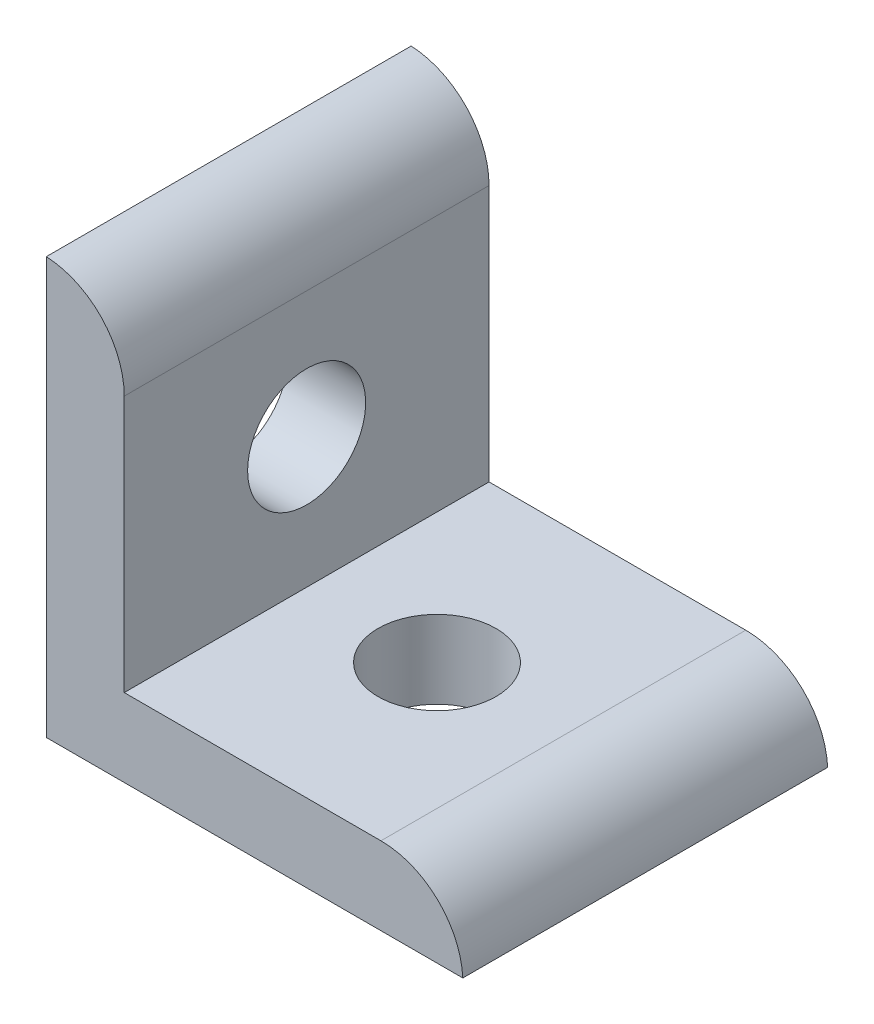
ISO-10303-21;
HEADER;
FILE_DESCRIPTION(('STEP AP214'),'2;1');
FILE_NAME('part.step','',(''),(''),'','','');
FILE_SCHEMA(('AUTOMOTIVE_DESIGN { 1 0 10303 214 1 1 1 1 }'));
ENDSEC;
DATA;
#1=APPLICATION_CONTEXT('core data for automotive mechanical design processes');
#2=APPLICATION_PROTOCOL_DEFINITION('international standard','automotive_design',2000,#1);
#3=PRODUCT_CONTEXT('',#1,'mechanical');
#4=PRODUCT('Part','Part','',(#3));
#5=PRODUCT_RELATED_PRODUCT_CATEGORY('part','',(#4));
#6=PRODUCT_DEFINITION_FORMATION('','',#4);
#7=PRODUCT_DEFINITION_CONTEXT('part definition',#1,'design');
#8=PRODUCT_DEFINITION('design','',#6,#7);
#9=PRODUCT_DEFINITION_SHAPE('','',#8);
#10=(LENGTH_UNIT() NAMED_UNIT(*) SI_UNIT(.MILLI.,.METRE.));
#11=(NAMED_UNIT(*) PLANE_ANGLE_UNIT() SI_UNIT($,.RADIAN.));
#12=(NAMED_UNIT(*) SI_UNIT($,.STERADIAN.) SOLID_ANGLE_UNIT());
#13=UNCERTAINTY_MEASURE_WITH_UNIT(LENGTH_MEASURE(1.E-05),#10,'distance_accuracy_value','');
#14=(GEOMETRIC_REPRESENTATION_CONTEXT(3) GLOBAL_UNCERTAINTY_ASSIGNED_CONTEXT((#13)) GLOBAL_UNIT_ASSIGNED_CONTEXT((#10,
#11,#12)) REPRESENTATION_CONTEXT('',''));
#15=CARTESIAN_POINT('',(0.,0.,0.));
#16=DIRECTION('',(0.,0.,1.));
#17=DIRECTION('',(1.,0.,0.));
#18=AXIS2_PLACEMENT_3D('',#15,#16,#17);
#19=CARTESIAN_POINT('',(0.,25.4,22.25));
#20=DIRECTION('',(1.,0.,0.));
#21=DIRECTION('',(0.,0.,-1.));
#22=AXIS2_PLACEMENT_3D('',#19,#20,#21);
#23=PLANE('',#22);
#24=CARTESIAN_POINT('',(0.,12.7,11.125));
#25=DIRECTION('',(-1.,0.,0.));
#26=DIRECTION('',(0.,0.,1.));
#27=AXIS2_PLACEMENT_3D('',#24,#25,#26);
#28=CIRCLE('',#27,3.6);
#29=CARTESIAN_POINT('',(0.,12.7,14.725));
#30=VERTEX_POINT('',#29);
#31=EDGE_CURVE('E164',#30,#30,#28,.T.);
#32=ORIENTED_EDGE('',*,*,#31,.F.);
#33=EDGE_LOOP('',(#32));
#34=FACE_BOUND('',#33,.T.);
#35=DIRECTION('',(0.,-1.,0.));
#36=VECTOR('',#35,1.);
#37=CARTESIAN_POINT('',(0.,25.4,0.));
#38=LINE('',#37,#36);
#39=CARTESIAN_POINT('',(0.,25.4,0.));
#40=VERTEX_POINT('',#39);
#41=CARTESIAN_POINT('',(0.,0.,0.));
#42=VERTEX_POINT('',#41);
#43=EDGE_CURVE('E131',#40,#42,#38,.T.);
#44=ORIENTED_EDGE('',*,*,#43,.T.);
#45=DIRECTION('',(0.,0.,-1.));
#46=VECTOR('',#45,1.);
#47=CARTESIAN_POINT('',(0.,0.,22.25));
#48=LINE('',#47,#46);
#49=CARTESIAN_POINT('',(0.,0.,22.25));
#50=VERTEX_POINT('',#49);
#51=EDGE_CURVE('E109',#50,#42,#48,.T.);
#52=ORIENTED_EDGE('',*,*,#51,.F.);
#53=DIRECTION('',(0.,-1.,0.));
#54=VECTOR('',#53,1.);
#55=CARTESIAN_POINT('',(0.,25.4,22.25));
#56=LINE('',#55,#54);
#57=CARTESIAN_POINT('',(0.,25.4,22.25));
#58=VERTEX_POINT('',#57);
#59=EDGE_CURVE('E100',#58,#50,#56,.T.);
#60=ORIENTED_EDGE('',*,*,#59,.F.);
#61=DIRECTION('',(0.,0.,-1.));
#62=VECTOR('',#61,1.);
#63=CARTESIAN_POINT('',(0.,25.4,22.25));
#64=LINE('',#63,#62);
#65=EDGE_CURVE('E107',#58,#40,#64,.T.);
#66=ORIENTED_EDGE('',*,*,#65,.T.);
#67=EDGE_LOOP('',(#44,#52,#60,#66));
#68=FACE_BOUND('',#67,.T.);
#69=ADVANCED_FACE('F45',(#34,#68),#23,.F.);
#70=CARTESIAN_POINT('',(0.,0.,22.25));
#71=DIRECTION('',(0.,1.,0.));
#72=DIRECTION('',(0.,0.,1.));
#73=AXIS2_PLACEMENT_3D('',#70,#71,#72);
#74=PLANE('',#73);
#75=CARTESIAN_POINT('',(12.7,0.,11.125));
#76=DIRECTION('',(0.,-1.,0.));
#77=DIRECTION('',(0.,0.,-1.));
#78=AXIS2_PLACEMENT_3D('',#75,#76,#77);
#79=CIRCLE('',#78,3.6);
#80=CARTESIAN_POINT('',(12.7,0.,7.525));
#81=VERTEX_POINT('',#80);
#82=EDGE_CURVE('E158',#81,#81,#79,.T.);
#83=ORIENTED_EDGE('',*,*,#82,.F.);
#84=EDGE_LOOP('',(#83));
#85=FACE_BOUND('',#84,.T.);
#86=DIRECTION('',(1.,0.,0.));
#87=VECTOR('',#86,1.);
#88=CARTESIAN_POINT('',(0.,0.,0.));
#89=LINE('',#88,#87);
#90=CARTESIAN_POINT('',(25.4,0.,0.));
#91=VERTEX_POINT('',#90);
#92=EDGE_CURVE('E138',#42,#91,#89,.T.);
#93=ORIENTED_EDGE('',*,*,#92,.T.);
#94=DIRECTION('',(0.,0.,-1.));
#95=VECTOR('',#94,1.);
#96=CARTESIAN_POINT('',(25.4,0.,22.25));
#97=LINE('',#96,#95);
#98=CARTESIAN_POINT('',(25.4,0.,22.25));
#99=VERTEX_POINT('',#98);
#100=EDGE_CURVE('E120',#99,#91,#97,.T.);
#101=ORIENTED_EDGE('',*,*,#100,.F.);
#102=DIRECTION('',(1.,0.,0.));
#103=VECTOR('',#102,1.);
#104=CARTESIAN_POINT('',(0.,0.,22.25));
#105=LINE('',#104,#103);
#106=EDGE_CURVE('E111',#50,#99,#105,.T.);
#107=ORIENTED_EDGE('',*,*,#106,.F.);
#108=ORIENTED_EDGE('',*,*,#51,.T.);
#109=EDGE_LOOP('',(#93,#101,#107,#108));
#110=FACE_BOUND('',#109,.T.);
#111=ADVANCED_FACE('F148',(#85,#110),#74,.F.);
#112=CARTESIAN_POINT('',(25.4,4.75,22.25));
#113=DIRECTION('',(0.,-1.,0.));
#114=DIRECTION('',(1.,0.,0.));
#115=AXIS2_PLACEMENT_3D('',#112,#113,#114);
#116=PLANE('',#115);
#117=CARTESIAN_POINT('',(12.7,4.75,11.125));
#118=DIRECTION('',(0.,-1.,0.));
#119=DIRECTION('',(1.,0.,0.));
#120=AXIS2_PLACEMENT_3D('',#117,#118,#119);
#121=CIRCLE('',#120,3.6);
#122=CARTESIAN_POINT('',(12.7,4.75,7.525));
#123=VERTEX_POINT('',#122);
#124=EDGE_CURVE('E149',#123,#123,#121,.F.);
#125=ORIENTED_EDGE('',*,*,#124,.F.);
#126=EDGE_LOOP('',(#125));
#127=FACE_BOUND('',#126,.T.);
#128=DIRECTION('',(-1.,0.,0.));
#129=VECTOR('',#128,1.);
#130=CARTESIAN_POINT('',(25.4,4.75,22.25));
#131=LINE('',#130,#129);
#132=CARTESIAN_POINT('',(20.4062539111405,4.75,22.25));
#133=VERTEX_POINT('',#132);
#134=CARTESIAN_POINT('',(4.75,4.75,22.25));
#135=VERTEX_POINT('',#134);
#136=EDGE_CURVE('E153',#133,#135,#131,.T.);
#137=ORIENTED_EDGE('',*,*,#136,.F.);
#138=DIRECTION('',(0.,0.,-1.));
#139=VECTOR('',#138,1.);
#140=CARTESIAN_POINT('',(20.4062539111405,4.75,22.25));
#141=LINE('',#140,#139);
#142=CARTESIAN_POINT('',(20.4062539111405,4.75,0.));
#143=VERTEX_POINT('',#142);
#144=EDGE_CURVE('E11',#133,#143,#141,.T.);
#145=ORIENTED_EDGE('',*,*,#144,.T.);
#146=DIRECTION('',(-1.,0.,0.));
#147=VECTOR('',#146,1.);
#148=CARTESIAN_POINT('',(25.4,4.75,0.));
#149=LINE('',#148,#147);
#150=CARTESIAN_POINT('',(4.75,4.75,0.));
#151=VERTEX_POINT('',#150);
#152=EDGE_CURVE('E136',#143,#151,#149,.T.);
#153=ORIENTED_EDGE('',*,*,#152,.T.);
#154=DIRECTION('',(0.,0.,-1.));
#155=VECTOR('',#154,1.);
#156=CARTESIAN_POINT('',(4.75,4.75,22.25));
#157=LINE('',#156,#155);
#158=EDGE_CURVE('E135',#135,#151,#157,.T.);
#159=ORIENTED_EDGE('',*,*,#158,.F.);
#160=EDGE_LOOP('',(#137,#145,#153,#159));
#161=FACE_BOUND('',#160,.T.);
#162=ADVANCED_FACE('F178',(#127,#161),#116,.F.);
#163=CARTESIAN_POINT('',(4.75,4.75,22.25));
#164=DIRECTION('',(-1.,0.,0.));
#165=DIRECTION('',(0.,-1.,0.));
#166=AXIS2_PLACEMENT_3D('',#163,#164,#165);
#167=PLANE('',#166);
#168=CARTESIAN_POINT('',(4.75,12.7,11.125));
#169=DIRECTION('',(-1.,0.,0.));
#170=DIRECTION('',(0.,-1.,0.));
#171=AXIS2_PLACEMENT_3D('',#168,#169,#170);
#172=CIRCLE('',#171,3.6);
#173=CARTESIAN_POINT('',(4.75,12.7,14.725));
#174=VERTEX_POINT('',#173);
#175=EDGE_CURVE('E161',#174,#174,#172,.F.);
#176=ORIENTED_EDGE('',*,*,#175,.F.);
#177=EDGE_LOOP('',(#176));
#178=FACE_BOUND('',#177,.T.);
#179=DIRECTION('',(0.,1.,0.));
#180=VECTOR('',#179,1.);
#181=CARTESIAN_POINT('',(4.75,4.75,0.));
#182=LINE('',#181,#180);
#183=CARTESIAN_POINT('',(4.75,20.4062539111405,0.));
#184=VERTEX_POINT('',#183);
#185=EDGE_CURVE('E112',#151,#184,#182,.T.);
#186=ORIENTED_EDGE('',*,*,#185,.T.);
#187=DIRECTION('',(0.,0.,1.));
#188=VECTOR('',#187,1.);
#189=CARTESIAN_POINT('',(4.75,20.4062539111405,22.25));
#190=LINE('',#189,#188);
#191=CARTESIAN_POINT('',(4.75,20.4062539111405,22.25));
#192=VERTEX_POINT('',#191);
#193=EDGE_CURVE('E68',#184,#192,#190,.T.);
#194=ORIENTED_EDGE('',*,*,#193,.T.);
#195=DIRECTION('',(0.,1.,0.));
#196=VECTOR('',#195,1.);
#197=CARTESIAN_POINT('',(4.75,4.75,22.25));
#198=LINE('',#197,#196);
#199=EDGE_CURVE('E102',#135,#192,#198,.T.);
#200=ORIENTED_EDGE('',*,*,#199,.F.);
#201=ORIENTED_EDGE('',*,*,#158,.T.);
#202=EDGE_LOOP('',(#186,#194,#200,#201));
#203=FACE_BOUND('',#202,.T.);
#204=ADVANCED_FACE('F133',(#178,#203),#167,.F.);
#205=CARTESIAN_POINT('',(0.,0.,22.25));
#206=DIRECTION('',(0.,0.,1.));
#207=DIRECTION('',(1.,0.,0.));
#208=AXIS2_PLACEMENT_3D('',#205,#206,#207);
#209=PLANE('',#208);
#210=ORIENTED_EDGE('',*,*,#199,.T.);
#211=CARTESIAN_POINT('',(-0.25,20.4062539111405,22.25));
#212=DIRECTION('',(0.,0.,1.));
#213=DIRECTION('',(1.,0.,0.));
#214=AXIS2_PLACEMENT_3D('',#211,#212,#213);
#215=CIRCLE('',#214,5.);
#216=EDGE_CURVE('E53',#192,#58,#215,.T.);
#217=ORIENTED_EDGE('',*,*,#216,.T.);
#218=ORIENTED_EDGE('',*,*,#59,.T.);
#219=ORIENTED_EDGE('',*,*,#106,.T.);
#220=CARTESIAN_POINT('',(20.4062539111405,-0.250000000000001,22.25));
#221=DIRECTION('',(0.,0.,1.));
#222=DIRECTION('',(1.,0.,0.));
#223=AXIS2_PLACEMENT_3D('',#220,#221,#222);
#224=CIRCLE('',#223,5.);
#225=EDGE_CURVE('E60',#99,#133,#224,.T.);
#226=ORIENTED_EDGE('',*,*,#225,.T.);
#227=ORIENTED_EDGE('',*,*,#136,.T.);
#228=EDGE_LOOP('',(#210,#217,#218,#219,#226,#227));
#229=FACE_BOUND('',#228,.T.);
#230=ADVANCED_FACE('F99',(#229),#209,.T.);
#231=CARTESIAN_POINT('',(0.,0.,0.));
#232=DIRECTION('',(0.,0.,1.));
#233=DIRECTION('',(1.,0.,0.));
#234=AXIS2_PLACEMENT_3D('',#231,#232,#233);
#235=PLANE('',#234);
#236=ORIENTED_EDGE('',*,*,#43,.F.);
#237=CARTESIAN_POINT('',(-0.25,20.4062539111405,0.));
#238=DIRECTION('',(0.,0.,1.));
#239=DIRECTION('',(1.,0.,0.));
#240=AXIS2_PLACEMENT_3D('',#237,#238,#239);
#241=CIRCLE('',#240,5.);
#242=EDGE_CURVE('E115',#40,#184,#241,.F.);
#243=ORIENTED_EDGE('',*,*,#242,.T.);
#244=ORIENTED_EDGE('',*,*,#185,.F.);
#245=ORIENTED_EDGE('',*,*,#152,.F.);
#246=CARTESIAN_POINT('',(20.4062539111405,-0.250000000000001,0.));
#247=DIRECTION('',(0.,0.,1.));
#248=DIRECTION('',(1.,0.,0.));
#249=AXIS2_PLACEMENT_3D('',#246,#247,#248);
#250=CIRCLE('',#249,5.);
#251=EDGE_CURVE('E117',#143,#91,#250,.F.);
#252=ORIENTED_EDGE('',*,*,#251,.T.);
#253=ORIENTED_EDGE('',*,*,#92,.F.);
#254=EDGE_LOOP('',(#236,#243,#244,#245,#252,#253));
#255=FACE_BOUND('',#254,.T.);
#256=ADVANCED_FACE('F128',(#255),#235,.F.);
#257=CARTESIAN_POINT('',(-0.25,20.4062539111405,22.25));
#258=DIRECTION('',(0.,0.,1.));
#259=DIRECTION('',(1.,0.,0.));
#260=AXIS2_PLACEMENT_3D('',#257,#258,#259);
#261=CYLINDRICAL_SURFACE('',#260,5.);
#262=ORIENTED_EDGE('',*,*,#216,.F.);
#263=ORIENTED_EDGE('',*,*,#193,.F.);
#264=ORIENTED_EDGE('',*,*,#242,.F.);
#265=ORIENTED_EDGE('',*,*,#65,.F.);
#266=EDGE_LOOP('',(#262,#263,#264,#265));
#267=FACE_BOUND('',#266,.T.);
#268=ADVANCED_FACE('F114',(#267),#261,.T.);
#269=CARTESIAN_POINT('',(20.4062539111405,-0.250000000000001,22.25));
#270=DIRECTION('',(0.,0.,-1.));
#271=DIRECTION('',(-1.,0.,0.));
#272=AXIS2_PLACEMENT_3D('',#269,#270,#271);
#273=CYLINDRICAL_SURFACE('',#272,5.);
#274=ORIENTED_EDGE('',*,*,#225,.F.);
#275=ORIENTED_EDGE('',*,*,#100,.T.);
#276=ORIENTED_EDGE('',*,*,#251,.F.);
#277=ORIENTED_EDGE('',*,*,#144,.F.);
#278=EDGE_LOOP('',(#274,#275,#276,#277));
#279=FACE_BOUND('',#278,.T.);
#280=ADVANCED_FACE('F47',(#279),#273,.T.);
#281=CARTESIAN_POINT('',(12.7,25.401,11.125));
#282=DIRECTION('',(0.,-1.,0.));
#283=DIRECTION('',(0.,0.,-1.));
#284=AXIS2_PLACEMENT_3D('',#281,#282,#283);
#285=CYLINDRICAL_SURFACE('',#284,3.6);
#286=CARTESIAN_POINT('',(12.7,0.,7.525));
#287=CARTESIAN_POINT('',(12.7,0.0494791666666705,7.525));
#288=CARTESIAN_POINT('',(12.7,0.0989583333333375,7.525));
#289=CARTESIAN_POINT('',(12.7,0.19791666666667,7.525));
#290=CARTESIAN_POINT('',(12.7,0.247395833333336,7.525));
#291=CARTESIAN_POINT('',(12.7,0.346354166666669,7.525));
#292=CARTESIAN_POINT('',(12.7,0.395833333333336,7.525));
#293=CARTESIAN_POINT('',(12.7,0.49479166666667,7.525));
#294=CARTESIAN_POINT('',(12.7,0.544270833333337,7.525));
#295=CARTESIAN_POINT('',(12.7,0.64322916666667,7.525));
#296=CARTESIAN_POINT('',(12.7,0.692708333333336,7.525));
#297=CARTESIAN_POINT('',(12.7,0.791666666666669,7.525));
#298=CARTESIAN_POINT('',(12.7,0.841145833333336,7.525));
#299=CARTESIAN_POINT('',(12.7,0.94010416666667,7.525));
#300=CARTESIAN_POINT('',(12.7,0.989583333333336,7.525));
#301=CARTESIAN_POINT('',(12.7,1.08854166666667,7.525));
#302=CARTESIAN_POINT('',(12.7,1.13802083333334,7.525));
#303=CARTESIAN_POINT('',(12.7,1.23697916666667,7.525));
#304=CARTESIAN_POINT('',(12.7,1.28645833333334,7.525));
#305=CARTESIAN_POINT('',(12.7,1.38541666666667,7.525));
#306=CARTESIAN_POINT('',(12.7,1.43489583333334,7.525));
#307=CARTESIAN_POINT('',(12.7,1.53385416666667,7.525));
#308=CARTESIAN_POINT('',(12.7,1.58333333333334,7.525));
#309=CARTESIAN_POINT('',(12.7,1.68229166666667,7.525));
#310=CARTESIAN_POINT('',(12.7,1.73177083333334,7.525));
#311=CARTESIAN_POINT('',(12.7,1.83072916666667,7.525));
#312=CARTESIAN_POINT('',(12.7,1.88020833333334,7.525));
#313=CARTESIAN_POINT('',(12.7,1.97916666666667,7.525));
#314=CARTESIAN_POINT('',(12.7,2.02864583333334,7.525));
#315=CARTESIAN_POINT('',(12.7,2.12760416666667,7.525));
#316=CARTESIAN_POINT('',(12.7,2.17708333333334,7.525));
#317=CARTESIAN_POINT('',(12.7,2.27604166666667,7.525));
#318=CARTESIAN_POINT('',(12.7,2.32552083333334,7.525));
#319=CARTESIAN_POINT('',(12.7,2.42447916666667,7.525));
#320=CARTESIAN_POINT('',(12.7,2.47395833333334,7.525));
#321=CARTESIAN_POINT('',(12.7,2.57291666666667,7.525));
#322=CARTESIAN_POINT('',(12.7,2.62239583333333,7.525));
#323=CARTESIAN_POINT('',(12.7,2.72135416666667,7.525));
#324=CARTESIAN_POINT('',(12.7,2.77083333333333,7.525));
#325=CARTESIAN_POINT('',(12.7,2.86979166666667,7.525));
#326=CARTESIAN_POINT('',(12.7,2.91927083333334,7.525));
#327=CARTESIAN_POINT('',(12.7,3.01822916666667,7.525));
#328=CARTESIAN_POINT('',(12.7,3.06770833333334,7.525));
#329=CARTESIAN_POINT('',(12.7,3.16666666666667,7.525));
#330=CARTESIAN_POINT('',(12.7,3.21614583333334,7.525));
#331=CARTESIAN_POINT('',(12.7,3.31510416666667,7.525));
#332=CARTESIAN_POINT('',(12.7,3.36458333333334,7.525));
#333=CARTESIAN_POINT('',(12.7,3.46354166666667,7.525));
#334=CARTESIAN_POINT('',(12.7,3.51302083333333,7.525));
#335=CARTESIAN_POINT('',(12.7,3.61197916666667,7.525));
#336=CARTESIAN_POINT('',(12.7,3.66145833333333,7.525));
#337=CARTESIAN_POINT('',(12.7,3.76041666666667,7.525));
#338=CARTESIAN_POINT('',(12.7,3.80989583333333,7.525));
#339=CARTESIAN_POINT('',(12.7,3.90885416666667,7.525));
#340=CARTESIAN_POINT('',(12.7,3.95833333333334,7.525));
#341=CARTESIAN_POINT('',(12.7,4.05729166666667,7.525));
#342=CARTESIAN_POINT('',(12.7,4.10677083333333,7.525));
#343=CARTESIAN_POINT('',(12.7,4.20572916666667,7.525));
#344=CARTESIAN_POINT('',(12.7,4.25520833333333,7.525));
#345=CARTESIAN_POINT('',(12.7,4.35416666666667,7.525));
#346=CARTESIAN_POINT('',(12.7,4.40364583333333,7.525));
#347=CARTESIAN_POINT('',(12.7,4.50260416666667,7.525));
#348=CARTESIAN_POINT('',(12.7,4.55208333333333,7.525));
#349=CARTESIAN_POINT('',(12.7,4.65104166666667,7.525));
#350=CARTESIAN_POINT('',(12.7,4.70052083333333,7.525));
#351=CARTESIAN_POINT('',(12.7,4.75,7.525));
#352=B_SPLINE_CURVE_WITH_KNOTS('',3,(#286,#287,#288,#289,#290,#291,#292,#293,#294,#295,#296,
#297,#298,#299,#300,#301,#302,#303,#304,#305,#306,#307,#308,#309,#310,#311,#312,#313,#314,#315,
#316,#317,#318,#319,#320,#321,#322,#323,#324,#325,#326,#327,#328,#329,#330,#331,#332,#333,#334,
#335,#336,#337,#338,#339,#340,#341,#342,#343,#344,#345,#346,#347,#348,#349,#350,#351),
.UNSPECIFIED.,.F.,.F.,(4,2,2,2,2,2,2,2,2,2,2,2,2,2,2,2,2,2,2,2,2,2,2,2,2,2,2,2,2,2,2,2,4),(0.,
0.148437500000001,0.296874999999999,0.4453125,0.593750000000001,0.742187499999998,
0.890624999999999,1.0390625,1.1875,1.3359375,1.484375,1.6328125,1.78125,1.9296875,2.078125,
2.2265625,2.375,2.5234375,2.671875,2.8203125,2.96875,3.1171875,3.265625,3.4140625,3.5625,
3.7109375,3.859375,4.0078125,4.15625,4.3046875,4.453125,4.6015625,4.75),.UNSPECIFIED.);
#353=EDGE_CURVE('BSEAM187',#81,#123,#352,.T.);
#354=ORIENTED_EDGE('',*,*,#82,.T.);
#355=ORIENTED_EDGE('',*,*,#124,.T.);
#356=ORIENTED_EDGE('',*,*,#353,.T.);
#357=ORIENTED_EDGE('',*,*,#353,.F.);
#358=EDGE_LOOP('',(#354,#356,#355,#357));
#359=FACE_BOUND('',#358,.T.);
#360=ADVANCED_FACE('F187',(#359),#285,.F.);
#361=CARTESIAN_POINT('',(25.401,12.7,11.125));
#362=DIRECTION('',(-1.,0.,0.));
#363=DIRECTION('',(0.,0.,1.));
#364=AXIS2_PLACEMENT_3D('',#361,#362,#363);
#365=CYLINDRICAL_SURFACE('',#364,3.6);
#366=CARTESIAN_POINT('',(0.,12.7,14.725));
#367=CARTESIAN_POINT('',(0.0494791666666705,12.7,14.725));
#368=CARTESIAN_POINT('',(0.0989583333333375,12.7,14.725));
#369=CARTESIAN_POINT('',(0.19791666666667,12.7,14.725));
#370=CARTESIAN_POINT('',(0.247395833333336,12.7,14.725));
#371=CARTESIAN_POINT('',(0.346354166666669,12.7,14.725));
#372=CARTESIAN_POINT('',(0.395833333333336,12.7,14.725));
#373=CARTESIAN_POINT('',(0.49479166666667,12.7,14.725));
#374=CARTESIAN_POINT('',(0.544270833333337,12.7,14.725));
#375=CARTESIAN_POINT('',(0.64322916666667,12.7,14.725));
#376=CARTESIAN_POINT('',(0.692708333333336,12.7,14.725));
#377=CARTESIAN_POINT('',(0.791666666666669,12.7,14.725));
#378=CARTESIAN_POINT('',(0.841145833333336,12.7,14.725));
#379=CARTESIAN_POINT('',(0.94010416666667,12.7,14.725));
#380=CARTESIAN_POINT('',(0.989583333333336,12.7,14.725));
#381=CARTESIAN_POINT('',(1.08854166666667,12.7,14.725));
#382=CARTESIAN_POINT('',(1.13802083333334,12.7,14.725));
#383=CARTESIAN_POINT('',(1.23697916666667,12.7,14.725));
#384=CARTESIAN_POINT('',(1.28645833333334,12.7,14.725));
#385=CARTESIAN_POINT('',(1.38541666666667,12.7,14.725));
#386=CARTESIAN_POINT('',(1.43489583333334,12.7,14.725));
#387=CARTESIAN_POINT('',(1.53385416666667,12.7,14.725));
#388=CARTESIAN_POINT('',(1.58333333333334,12.7,14.725));
#389=CARTESIAN_POINT('',(1.68229166666667,12.7,14.725));
#390=CARTESIAN_POINT('',(1.73177083333334,12.7,14.725));
#391=CARTESIAN_POINT('',(1.83072916666667,12.7,14.725));
#392=CARTESIAN_POINT('',(1.88020833333334,12.7,14.725));
#393=CARTESIAN_POINT('',(1.97916666666667,12.7,14.725));
#394=CARTESIAN_POINT('',(2.02864583333334,12.7,14.725));
#395=CARTESIAN_POINT('',(2.12760416666667,12.7,14.725));
#396=CARTESIAN_POINT('',(2.17708333333334,12.7,14.725));
#397=CARTESIAN_POINT('',(2.27604166666667,12.7,14.725));
#398=CARTESIAN_POINT('',(2.32552083333334,12.7,14.725));
#399=CARTESIAN_POINT('',(2.42447916666667,12.7,14.725));
#400=CARTESIAN_POINT('',(2.47395833333334,12.7,14.725));
#401=CARTESIAN_POINT('',(2.57291666666667,12.7,14.725));
#402=CARTESIAN_POINT('',(2.62239583333333,12.7,14.725));
#403=CARTESIAN_POINT('',(2.72135416666667,12.7,14.725));
#404=CARTESIAN_POINT('',(2.77083333333333,12.7,14.725));
#405=CARTESIAN_POINT('',(2.86979166666667,12.7,14.725));
#406=CARTESIAN_POINT('',(2.91927083333334,12.7,14.725));
#407=CARTESIAN_POINT('',(3.01822916666667,12.7,14.725));
#408=CARTESIAN_POINT('',(3.06770833333334,12.7,14.725));
#409=CARTESIAN_POINT('',(3.16666666666667,12.7,14.725));
#410=CARTESIAN_POINT('',(3.21614583333334,12.7,14.725));
#411=CARTESIAN_POINT('',(3.31510416666667,12.7,14.725));
#412=CARTESIAN_POINT('',(3.36458333333334,12.7,14.725));
#413=CARTESIAN_POINT('',(3.46354166666667,12.7,14.725));
#414=CARTESIAN_POINT('',(3.51302083333333,12.7,14.725));
#415=CARTESIAN_POINT('',(3.61197916666667,12.7,14.725));
#416=CARTESIAN_POINT('',(3.66145833333333,12.7,14.725));
#417=CARTESIAN_POINT('',(3.76041666666667,12.7,14.725));
#418=CARTESIAN_POINT('',(3.80989583333333,12.7,14.725));
#419=CARTESIAN_POINT('',(3.90885416666667,12.7,14.725));
#420=CARTESIAN_POINT('',(3.95833333333334,12.7,14.725));
#421=CARTESIAN_POINT('',(4.05729166666667,12.7,14.725));
#422=CARTESIAN_POINT('',(4.10677083333333,12.7,14.725));
#423=CARTESIAN_POINT('',(4.20572916666667,12.7,14.725));
#424=CARTESIAN_POINT('',(4.25520833333333,12.7,14.725));
#425=CARTESIAN_POINT('',(4.35416666666667,12.7,14.725));
#426=CARTESIAN_POINT('',(4.40364583333333,12.7,14.725));
#427=CARTESIAN_POINT('',(4.50260416666667,12.7,14.725));
#428=CARTESIAN_POINT('',(4.55208333333333,12.7,14.725));
#429=CARTESIAN_POINT('',(4.65104166666667,12.7,14.725));
#430=CARTESIAN_POINT('',(4.70052083333333,12.7,14.725));
#431=CARTESIAN_POINT('',(4.75,12.7,14.725));
#432=B_SPLINE_CURVE_WITH_KNOTS('',3,(#366,#367,#368,#369,#370,#371,#372,#373,#374,#375,#376,
#377,#378,#379,#380,#381,#382,#383,#384,#385,#386,#387,#388,#389,#390,#391,#392,#393,#394,#395,
#396,#397,#398,#399,#400,#401,#402,#403,#404,#405,#406,#407,#408,#409,#410,#411,#412,#413,#414,
#415,#416,#417,#418,#419,#420,#421,#422,#423,#424,#425,#426,#427,#428,#429,#430,#431),
.UNSPECIFIED.,.F.,.F.,(4,2,2,2,2,2,2,2,2,2,2,2,2,2,2,2,2,2,2,2,2,2,2,2,2,2,2,2,2,2,2,2,4),(0.,
0.148437500000001,0.296874999999999,0.4453125,0.593750000000001,0.742187499999998,
0.890624999999999,1.0390625,1.1875,1.3359375,1.484375,1.6328125,1.78125,1.9296875,2.078125,
2.2265625,2.375,2.5234375,2.671875,2.8203125,2.96875,3.1171875,3.265625,3.4140625,3.5625,
3.7109375,3.859375,4.0078125,4.15625,4.3046875,4.453125,4.6015625,4.75),.UNSPECIFIED.);
#433=EDGE_CURVE('BSEAM168',#30,#174,#432,.T.);
#434=ORIENTED_EDGE('',*,*,#31,.T.);
#435=ORIENTED_EDGE('',*,*,#175,.T.);
#436=ORIENTED_EDGE('',*,*,#433,.T.);
#437=ORIENTED_EDGE('',*,*,#433,.F.);
#438=EDGE_LOOP('',(#434,#436,#435,#437));
#439=FACE_BOUND('',#438,.T.);
#440=ADVANCED_FACE('F168',(#439),#365,.F.);
#441=CLOSED_SHELL('',(#69,#111,#162,#204,#230,#256,#268,#280,#360,#440));
#442=MANIFOLD_SOLID_BREP('B2',#441);
#443=ADVANCED_BREP_SHAPE_REPRESENTATION('',(#18,#442),#14);
#444=SHAPE_DEFINITION_REPRESENTATION(#9,#443);
ENDSEC;
END-ISO-10303-21;
